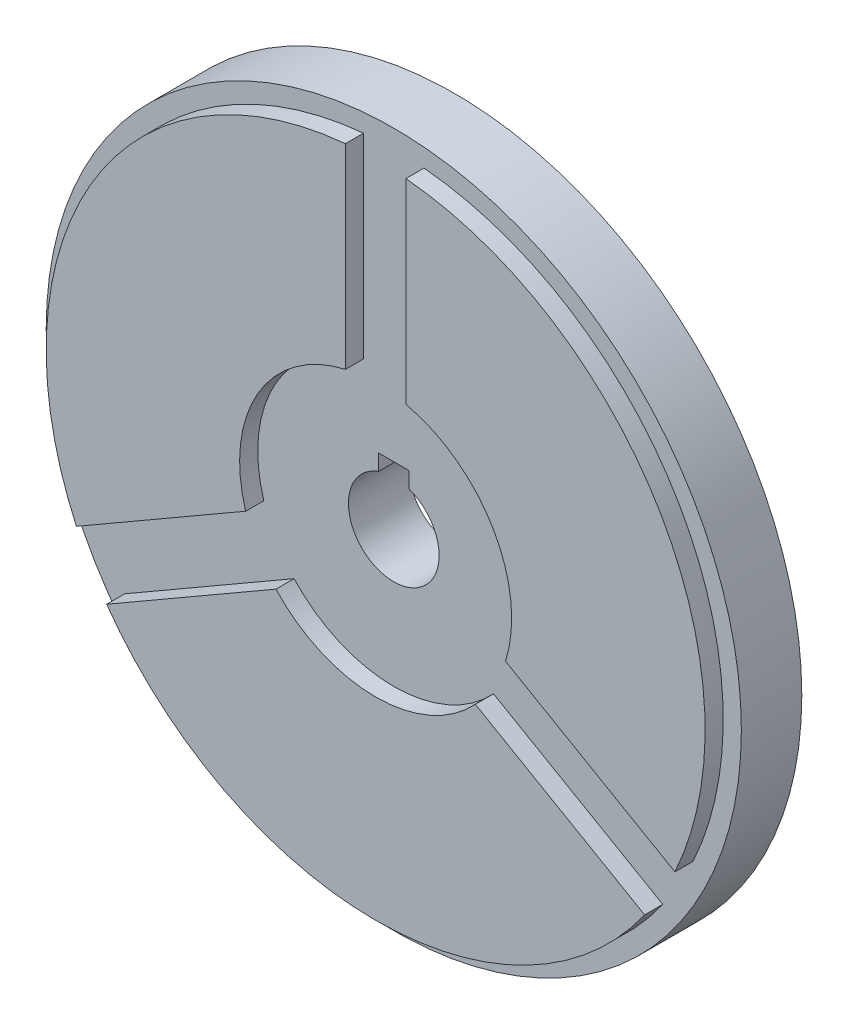
ISO-10303-21;
HEADER;
FILE_DESCRIPTION(('STEP AP214'),'2;1');
FILE_NAME('part.step','',(''),(''),'','','');
FILE_SCHEMA(('AUTOMOTIVE_DESIGN { 1 0 10303 214 1 1 1 1 }'));
ENDSEC;
DATA;
#1=APPLICATION_CONTEXT('core data for automotive mechanical design processes');
#2=APPLICATION_PROTOCOL_DEFINITION('international standard','automotive_design',2000,#1);
#3=PRODUCT_CONTEXT('',#1,'mechanical');
#4=PRODUCT('Part','Part','',(#3));
#5=PRODUCT_RELATED_PRODUCT_CATEGORY('part','',(#4));
#6=PRODUCT_DEFINITION_FORMATION('','',#4);
#7=PRODUCT_DEFINITION_CONTEXT('part definition',#1,'design');
#8=PRODUCT_DEFINITION('design','',#6,#7);
#9=PRODUCT_DEFINITION_SHAPE('','',#8);
#10=(LENGTH_UNIT() NAMED_UNIT(*) SI_UNIT(.MILLI.,.METRE.));
#11=(NAMED_UNIT(*) PLANE_ANGLE_UNIT() SI_UNIT($,.RADIAN.));
#12=(NAMED_UNIT(*) SI_UNIT($,.STERADIAN.) SOLID_ANGLE_UNIT());
#13=UNCERTAINTY_MEASURE_WITH_UNIT(LENGTH_MEASURE(1.E-05),#10,'distance_accuracy_value','');
#14=(GEOMETRIC_REPRESENTATION_CONTEXT(3) GLOBAL_UNCERTAINTY_ASSIGNED_CONTEXT((#13)) GLOBAL_UNIT_ASSIGNED_CONTEXT((#10,
#11,#12)) REPRESENTATION_CONTEXT('',''));
#15=CARTESIAN_POINT('',(0.,0.,0.));
#16=DIRECTION('',(0.,0.,1.));
#17=DIRECTION('',(1.,0.,0.));
#18=AXIS2_PLACEMENT_3D('',#15,#16,#17);
#19=CARTESIAN_POINT('',(0.,0.,-10.));
#20=DIRECTION('',(0.,0.,1.));
#21=DIRECTION('',(1.,0.,0.));
#22=AXIS2_PLACEMENT_3D('',#19,#20,#21);
#23=CYLINDRICAL_SURFACE('',#22,57.5);
#24=CARTESIAN_POINT('',(0.,0.,-10.));
#25=DIRECTION('',(0.,0.,1.));
#26=DIRECTION('',(1.,0.,0.));
#27=AXIS2_PLACEMENT_3D('',#24,#25,#26);
#28=CIRCLE('',#27,57.5);
#29=CARTESIAN_POINT('',(57.5,0.,-10.));
#30=VERTEX_POINT('',#29);
#31=EDGE_CURVE('E322',#30,#30,#28,.T.);
#32=ORIENTED_EDGE('',*,*,#31,.T.);
#33=EDGE_LOOP('',(#32));
#34=FACE_BOUND('',#33,.T.);
#35=CARTESIAN_POINT('',(0.,0.,0.));
#36=DIRECTION('',(0.,0.,1.));
#37=DIRECTION('',(1.,0.,0.));
#38=AXIS2_PLACEMENT_3D('',#35,#36,#37);
#39=CIRCLE('',#38,57.5);
#40=CARTESIAN_POINT('',(57.5,0.,0.));
#41=VERTEX_POINT('',#40);
#42=EDGE_CURVE('E319',#41,#41,#39,.T.);
#43=ORIENTED_EDGE('',*,*,#42,.F.);
#44=EDGE_LOOP('',(#43));
#45=FACE_BOUND('',#44,.T.);
#46=ADVANCED_FACE('F80',(#34,#45),#23,.T.);
#47=CARTESIAN_POINT('',(0.,0.,-10.));
#48=DIRECTION('',(0.,0.,1.));
#49=DIRECTION('',(1.,0.,0.));
#50=AXIS2_PLACEMENT_3D('',#47,#48,#49);
#51=PLANE('',#50);
#52=CARTESIAN_POINT('',(0.,0.,-10.));
#53=DIRECTION('',(0.,0.,1.));
#54=DIRECTION('',(1.,0.,0.));
#55=AXIS2_PLACEMENT_3D('',#52,#53,#54);
#56=CIRCLE('',#55,7.5);
#57=CARTESIAN_POINT('',(-2.5,7.07106781186548,-10.));
#58=VERTEX_POINT('',#57);
#59=CARTESIAN_POINT('',(2.5,7.07106781186548,-10.));
#60=VERTEX_POINT('',#59);
#61=EDGE_CURVE('E215',#58,#60,#56,.T.);
#62=ORIENTED_EDGE('',*,*,#61,.T.);
#63=DIRECTION('',(0.,1.,0.));
#64=VECTOR('',#63,1.);
#65=CARTESIAN_POINT('',(2.5,0.,-10.));
#66=LINE('',#65,#64);
#67=CARTESIAN_POINT('',(2.5,9.7,-10.));
#68=VERTEX_POINT('',#67);
#69=EDGE_CURVE('E195',#60,#68,#66,.T.);
#70=ORIENTED_EDGE('',*,*,#69,.T.);
#71=DIRECTION('',(-1.,0.,0.));
#72=VECTOR('',#71,1.);
#73=CARTESIAN_POINT('',(-2.5,9.7,-10.));
#74=LINE('',#73,#72);
#75=CARTESIAN_POINT('',(-2.5,9.7,-10.));
#76=VERTEX_POINT('',#75);
#77=EDGE_CURVE('E205',#68,#76,#74,.T.);
#78=ORIENTED_EDGE('',*,*,#77,.T.);
#79=DIRECTION('',(0.,-1.,0.));
#80=VECTOR('',#79,1.);
#81=CARTESIAN_POINT('',(-2.5,0.,-10.));
#82=LINE('',#81,#80);
#83=EDGE_CURVE('E202',#76,#58,#82,.T.);
#84=ORIENTED_EDGE('',*,*,#83,.T.);
#85=EDGE_LOOP('',(#62,#70,#78,#84));
#86=FACE_BOUND('',#85,.T.);
#87=ORIENTED_EDGE('',*,*,#31,.F.);
#88=EDGE_LOOP('',(#87));
#89=FACE_BOUND('',#88,.T.);
#90=ADVANCED_FACE('F212',(#86,#89),#51,.F.);
#91=CARTESIAN_POINT('',(0.,0.,0.));
#92=DIRECTION('',(0.,0.,1.));
#93=DIRECTION('',(1.,0.,0.));
#94=AXIS2_PLACEMENT_3D('',#91,#92,#93);
#95=PLANE('',#94);
#96=DIRECTION('',(0.,1.,0.));
#97=VECTOR('',#96,1.);
#98=CARTESIAN_POINT('',(2.5,0.,0.));
#99=LINE('',#98,#97);
#100=CARTESIAN_POINT('',(2.5,7.07106781186548,0.));
#101=VERTEX_POINT('',#100);
#102=CARTESIAN_POINT('',(2.5,9.7,0.));
#103=VERTEX_POINT('',#102);
#104=EDGE_CURVE('E197',#101,#103,#99,.T.);
#105=ORIENTED_EDGE('',*,*,#104,.F.);
#106=CARTESIAN_POINT('',(0.,0.,0.));
#107=DIRECTION('',(0.,0.,1.));
#108=DIRECTION('',(1.,0.,0.));
#109=AXIS2_PLACEMENT_3D('',#106,#107,#108);
#110=CIRCLE('',#109,7.5);
#111=CARTESIAN_POINT('',(-2.5,7.07106781186548,0.));
#112=VERTEX_POINT('',#111);
#113=EDGE_CURVE('E317',#112,#101,#110,.T.);
#114=ORIENTED_EDGE('',*,*,#113,.F.);
#115=DIRECTION('',(0.,-1.,0.));
#116=VECTOR('',#115,1.);
#117=CARTESIAN_POINT('',(-2.5,0.,0.));
#118=LINE('',#117,#116);
#119=CARTESIAN_POINT('',(-2.5,9.7,0.));
#120=VERTEX_POINT('',#119);
#121=EDGE_CURVE('E94',#120,#112,#118,.T.);
#122=ORIENTED_EDGE('',*,*,#121,.F.);
#123=DIRECTION('',(-1.,0.,0.));
#124=VECTOR('',#123,1.);
#125=CARTESIAN_POINT('',(-2.5,9.7,0.));
#126=LINE('',#125,#124);
#127=EDGE_CURVE('E217',#103,#120,#126,.T.);
#128=ORIENTED_EDGE('',*,*,#127,.F.);
#129=EDGE_LOOP('',(#105,#114,#122,#128));
#130=FACE_BOUND('',#129,.T.);
#131=CARTESIAN_POINT('',(0.,0.,0.));
#132=DIRECTION('',(0.,0.,1.));
#133=DIRECTION('',(1.,0.,0.));
#134=AXIS2_PLACEMENT_3D('',#131,#132,#133);
#135=CIRCLE('',#134,22.5);
#136=CARTESIAN_POINT('',(-16.4983551919635,-15.2988325031622,0.));
#137=VERTEX_POINT('',#136);
#138=CARTESIAN_POINT('',(16.4983551919633,-15.2988325031624,0.));
#139=VERTEX_POINT('',#138);
#140=EDGE_CURVE('E223',#137,#139,#135,.T.);
#141=ORIENTED_EDGE('',*,*,#140,.T.);
#142=DIRECTION('',(0.866025403784453,-0.499999999999975,0.));
#143=VECTOR('',#142,1.);
#144=CARTESIAN_POINT('',(52.3373440329332,-35.990482357979,0.));
#145=LINE('',#144,#143);
#146=CARTESIAN_POINT('',(44.4993351016807,-31.46520579161,0.));
#147=VERTEX_POINT('',#146);
#148=EDGE_CURVE('E229',#139,#147,#145,.T.);
#149=ORIENTED_EDGE('',*,*,#148,.T.);
#150=CARTESIAN_POINT('',(0.,0.,0.));
#151=DIRECTION('',(0.,0.,1.));
#152=DIRECTION('',(1.,0.,0.));
#153=AXIS2_PLACEMENT_3D('',#150,#151,#152);
#154=CIRCLE('',#153,54.5);
#155=CARTESIAN_POINT('',(-44.4993351016794,-31.4652057916112,0.));
#156=VERTEX_POINT('',#155);
#157=EDGE_CURVE('E239',#156,#147,#154,.T.);
#158=ORIENTED_EDGE('',*,*,#157,.F.);
#159=DIRECTION('',(-0.866025403784422,-0.500000000000028,0.));
#160=VECTOR('',#159,1.);
#161=CARTESIAN_POINT('',(-52.3373440329377,-35.9904823579842,0.));
#162=LINE('',#161,#160);
#163=EDGE_CURVE('E102',#137,#156,#162,.T.);
#164=ORIENTED_EDGE('',*,*,#163,.F.);
#165=EDGE_LOOP('',(#141,#149,#158,#164));
#166=FACE_BOUND('',#165,.T.);
#167=CARTESIAN_POINT('',(0.,0.,0.));
#168=DIRECTION('',(0.,0.,1.));
#169=DIRECTION('',(1.,0.,0.));
#170=AXIS2_PLACEMENT_3D('',#167,#168,#169);
#171=CIRCLE('',#170,22.5);
#172=CARTESIAN_POINT('',(-5.,21.9374109684803,0.));
#173=VERTEX_POINT('',#172);
#174=CARTESIAN_POINT('',(-21.4983551919634,-6.63857846531777,0.));
#175=VERTEX_POINT('',#174);
#176=EDGE_CURVE('E253',#173,#175,#171,.T.);
#177=ORIENTED_EDGE('',*,*,#176,.T.);
#178=DIRECTION('',(-0.866025403784422,-0.500000000000029,0.));
#179=VECTOR('',#178,1.);
#180=CARTESIAN_POINT('',(-57.337344032938,-27.33022832014,0.));
#181=LINE('',#180,#179);
#182=CARTESIAN_POINT('',(-49.4993351016791,-22.8049517537666,0.));
#183=VERTEX_POINT('',#182);
#184=EDGE_CURVE('E258',#175,#183,#181,.T.);
#185=ORIENTED_EDGE('',*,*,#184,.T.);
#186=CARTESIAN_POINT('',(0.,0.,0.));
#187=DIRECTION('',(0.,0.,1.));
#188=DIRECTION('',(1.,0.,0.));
#189=AXIS2_PLACEMENT_3D('',#186,#187,#188);
#190=CIRCLE('',#189,54.5);
#191=CARTESIAN_POINT('',(-5.,54.2701575453766,0.));
#192=VERTEX_POINT('',#191);
#193=EDGE_CURVE('E270',#192,#183,#190,.T.);
#194=ORIENTED_EDGE('',*,*,#193,.F.);
#195=DIRECTION('',(0.,1.,0.));
#196=VECTOR('',#195,1.);
#197=CARTESIAN_POINT('',(-5.,-126.641421356237,0.));
#198=LINE('',#197,#196);
#199=EDGE_CURVE('E267',#173,#192,#198,.T.);
#200=ORIENTED_EDGE('',*,*,#199,.F.);
#201=EDGE_LOOP('',(#177,#185,#194,#200));
#202=FACE_BOUND('',#201,.T.);
#203=CARTESIAN_POINT('',(0.,0.,0.));
#204=DIRECTION('',(0.,0.,1.));
#205=DIRECTION('',(1.,0.,0.));
#206=AXIS2_PLACEMENT_3D('',#203,#204,#205);
#207=CIRCLE('',#206,22.5);
#208=CARTESIAN_POINT('',(21.4983551919633,-6.63857846531805,0.));
#209=VERTEX_POINT('',#208);
#210=CARTESIAN_POINT('',(5.,21.9374109684803,0.));
#211=VERTEX_POINT('',#210);
#212=EDGE_CURVE('E285',#209,#211,#207,.T.);
#213=ORIENTED_EDGE('',*,*,#212,.T.);
#214=DIRECTION('',(0.,1.,0.));
#215=VECTOR('',#214,1.);
#216=CARTESIAN_POINT('',(5.,-126.641421356237,0.));
#217=LINE('',#216,#215);
#218=CARTESIAN_POINT('',(5.,54.2701575453766,0.));
#219=VERTEX_POINT('',#218);
#220=EDGE_CURVE('E290',#211,#219,#217,.T.);
#221=ORIENTED_EDGE('',*,*,#220,.T.);
#222=CARTESIAN_POINT('',(0.,0.,0.));
#223=DIRECTION('',(0.,0.,1.));
#224=DIRECTION('',(1.,0.,0.));
#225=AXIS2_PLACEMENT_3D('',#222,#223,#224);
#226=CIRCLE('',#225,54.5);
#227=CARTESIAN_POINT('',(49.4993351016802,-22.8049517537654,0.));
#228=VERTEX_POINT('',#227);
#229=EDGE_CURVE('E302',#228,#219,#226,.T.);
#230=ORIENTED_EDGE('',*,*,#229,.F.);
#231=DIRECTION('',(0.866025403784453,-0.499999999999975,0.));
#232=VECTOR('',#231,1.);
#233=CARTESIAN_POINT('',(57.337344032933,-27.3302283201345,0.));
#234=LINE('',#233,#232);
#235=EDGE_CURVE('E299',#209,#228,#234,.T.);
#236=ORIENTED_EDGE('',*,*,#235,.F.);
#237=EDGE_LOOP('',(#213,#221,#230,#236));
#238=FACE_BOUND('',#237,.T.);
#239=ORIENTED_EDGE('',*,*,#42,.T.);
#240=EDGE_LOOP('',(#239));
#241=FACE_BOUND('',#240,.T.);
#242=ADVANCED_FACE('F330',(#130,#166,#202,#238,#241),#95,.T.);
#243=CARTESIAN_POINT('',(0.,0.,-10.));
#244=DIRECTION('',(0.,0.,1.));
#245=DIRECTION('',(1.,0.,0.));
#246=AXIS2_PLACEMENT_3D('',#243,#244,#245);
#247=CYLINDRICAL_SURFACE('',#246,7.5);
#248=ORIENTED_EDGE('',*,*,#113,.T.);
#249=DIRECTION('',(0.,0.,1.));
#250=VECTOR('',#249,1.);
#251=CARTESIAN_POINT('',(2.5,7.07106781186548,-10.));
#252=LINE('',#251,#250);
#253=EDGE_CURVE('E12',#101,#60,#252,.F.);
#254=ORIENTED_EDGE('',*,*,#253,.T.);
#255=ORIENTED_EDGE('',*,*,#61,.F.);
#256=DIRECTION('',(0.,0.,1.));
#257=VECTOR('',#256,1.);
#258=CARTESIAN_POINT('',(-2.5,7.07106781186548,-10.));
#259=LINE('',#258,#257);
#260=EDGE_CURVE('E87',#58,#112,#259,.T.);
#261=ORIENTED_EDGE('',*,*,#260,.T.);
#262=EDGE_LOOP('',(#248,#254,#255,#261));
#263=FACE_BOUND('',#262,.T.);
#264=ADVANCED_FACE('F328',(#263),#247,.F.);
#265=CARTESIAN_POINT('',(0.,0.,3.));
#266=DIRECTION('',(0.,0.,-1.));
#267=DIRECTION('',(-1.,0.,0.));
#268=AXIS2_PLACEMENT_3D('',#265,#266,#267);
#269=CYLINDRICAL_SURFACE('',#268,22.5);
#270=ORIENTED_EDGE('',*,*,#212,.F.);
#271=DIRECTION('',(0.,0.,-1.));
#272=VECTOR('',#271,1.);
#273=CARTESIAN_POINT('',(21.4983551919633,-6.63857846531806,3.));
#274=LINE('',#273,#272);
#275=CARTESIAN_POINT('',(21.4983551919633,-6.63857846531806,3.));
#276=VERTEX_POINT('',#275);
#277=EDGE_CURVE('E314',#276,#209,#274,.T.);
#278=ORIENTED_EDGE('',*,*,#277,.F.);
#279=CARTESIAN_POINT('',(0.,0.,3.));
#280=DIRECTION('',(0.,0.,1.));
#281=DIRECTION('',(1.,0.,0.));
#282=AXIS2_PLACEMENT_3D('',#279,#280,#281);
#283=CIRCLE('',#282,22.5);
#284=CARTESIAN_POINT('',(5.,21.9374109684803,3.));
#285=VERTEX_POINT('',#284);
#286=EDGE_CURVE('E286',#276,#285,#283,.T.);
#287=ORIENTED_EDGE('',*,*,#286,.T.);
#288=DIRECTION('',(0.,0.,-1.));
#289=VECTOR('',#288,1.);
#290=CARTESIAN_POINT('',(5.,21.9374109684803,3.));
#291=LINE('',#290,#289);
#292=EDGE_CURVE('E297',#285,#211,#291,.T.);
#293=ORIENTED_EDGE('',*,*,#292,.T.);
#294=EDGE_LOOP('',(#270,#278,#287,#293));
#295=FACE_BOUND('',#294,.T.);
#296=ADVANCED_FACE('F352',(#295),#269,.F.);
#297=CARTESIAN_POINT('',(57.337344032933,-27.3302283201345,3.));
#298=DIRECTION('',(0.499999999999975,0.866025403784453,0.));
#299=DIRECTION('',(-0.866025403784453,0.499999999999975,0.));
#300=AXIS2_PLACEMENT_3D('',#297,#298,#299);
#301=PLANE('',#300);
#302=ORIENTED_EDGE('',*,*,#235,.T.);
#303=DIRECTION('',(0.,0.,-1.));
#304=VECTOR('',#303,1.);
#305=CARTESIAN_POINT('',(49.4993351016807,-22.8049517537656,3.));
#306=LINE('',#305,#304);
#307=CARTESIAN_POINT('',(49.4993351016807,-22.8049517537656,3.));
#308=VERTEX_POINT('',#307);
#309=EDGE_CURVE('E311',#308,#228,#306,.T.);
#310=ORIENTED_EDGE('',*,*,#309,.F.);
#311=DIRECTION('',(0.866025403784453,-0.499999999999975,0.));
#312=VECTOR('',#311,1.);
#313=CARTESIAN_POINT('',(57.337344032933,-27.3302283201345,3.));
#314=LINE('',#313,#312);
#315=EDGE_CURVE('E289',#276,#308,#314,.T.);
#316=ORIENTED_EDGE('',*,*,#315,.F.);
#317=ORIENTED_EDGE('',*,*,#277,.T.);
#318=EDGE_LOOP('',(#302,#310,#316,#317));
#319=FACE_BOUND('',#318,.T.);
#320=ADVANCED_FACE('F355',(#319),#301,.F.);
#321=CARTESIAN_POINT('',(0.,0.,3.));
#322=DIRECTION('',(0.,0.,-1.));
#323=DIRECTION('',(-1.,0.,0.));
#324=AXIS2_PLACEMENT_3D('',#321,#322,#323);
#325=CYLINDRICAL_SURFACE('',#324,54.5);
#326=ORIENTED_EDGE('',*,*,#229,.T.);
#327=DIRECTION('',(0.,0.,-1.));
#328=VECTOR('',#327,1.);
#329=CARTESIAN_POINT('',(5.,54.2701575453766,3.));
#330=LINE('',#329,#328);
#331=CARTESIAN_POINT('',(5.,54.2701575453766,3.));
#332=VERTEX_POINT('',#331);
#333=EDGE_CURVE('E308',#332,#219,#330,.T.);
#334=ORIENTED_EDGE('',*,*,#333,.F.);
#335=CARTESIAN_POINT('',(0.,0.,3.));
#336=DIRECTION('',(0.,0.,1.));
#337=DIRECTION('',(1.,0.,0.));
#338=AXIS2_PLACEMENT_3D('',#335,#336,#337);
#339=CIRCLE('',#338,54.5);
#340=EDGE_CURVE('E292',#308,#332,#339,.T.);
#341=ORIENTED_EDGE('',*,*,#340,.F.);
#342=ORIENTED_EDGE('',*,*,#309,.T.);
#343=EDGE_LOOP('',(#326,#334,#341,#342));
#344=FACE_BOUND('',#343,.T.);
#345=ADVANCED_FACE('F359',(#344),#325,.T.);
#346=CARTESIAN_POINT('',(5.,-126.641421356237,3.));
#347=DIRECTION('',(-1.,0.,0.));
#348=DIRECTION('',(0.,0.,1.));
#349=AXIS2_PLACEMENT_3D('',#346,#347,#348);
#350=PLANE('',#349);
#351=ORIENTED_EDGE('',*,*,#220,.F.);
#352=ORIENTED_EDGE('',*,*,#292,.F.);
#353=DIRECTION('',(0.,1.,0.));
#354=VECTOR('',#353,1.);
#355=CARTESIAN_POINT('',(5.,-126.641421356237,3.));
#356=LINE('',#355,#354);
#357=EDGE_CURVE('E294',#285,#332,#356,.T.);
#358=ORIENTED_EDGE('',*,*,#357,.T.);
#359=ORIENTED_EDGE('',*,*,#333,.T.);
#360=EDGE_LOOP('',(#351,#352,#358,#359));
#361=FACE_BOUND('',#360,.T.);
#362=ADVANCED_FACE('F363',(#361),#350,.T.);
#363=CARTESIAN_POINT('',(0.,-126.641421356237,3.));
#364=DIRECTION('',(0.,0.,1.));
#365=DIRECTION('',(1.,0.,0.));
#366=AXIS2_PLACEMENT_3D('',#363,#364,#365);
#367=PLANE('',#366);
#368=ORIENTED_EDGE('',*,*,#286,.F.);
#369=ORIENTED_EDGE('',*,*,#315,.T.);
#370=ORIENTED_EDGE('',*,*,#340,.T.);
#371=ORIENTED_EDGE('',*,*,#357,.F.);
#372=EDGE_LOOP('',(#368,#369,#370,#371));
#373=FACE_BOUND('',#372,.T.);
#374=ADVANCED_FACE('F367',(#373),#367,.T.);
#375=CARTESIAN_POINT('',(0.,0.,3.));
#376=DIRECTION('',(0.,0.,-1.));
#377=DIRECTION('',(-1.,0.,0.));
#378=AXIS2_PLACEMENT_3D('',#375,#376,#377);
#379=CYLINDRICAL_SURFACE('',#378,22.5);
#380=ORIENTED_EDGE('',*,*,#176,.F.);
#381=DIRECTION('',(0.,0.,-1.));
#382=VECTOR('',#381,1.);
#383=CARTESIAN_POINT('',(-5.,21.9374109684803,3.));
#384=LINE('',#383,#382);
#385=CARTESIAN_POINT('',(-5.,21.9374109684803,3.));
#386=VERTEX_POINT('',#385);
#387=EDGE_CURVE('E282',#386,#173,#384,.T.);
#388=ORIENTED_EDGE('',*,*,#387,.F.);
#389=CARTESIAN_POINT('',(0.,0.,3.));
#390=DIRECTION('',(0.,0.,1.));
#391=DIRECTION('',(1.,0.,0.));
#392=AXIS2_PLACEMENT_3D('',#389,#390,#391);
#393=CIRCLE('',#392,22.5);
#394=CARTESIAN_POINT('',(-21.4983551919634,-6.63857846531777,3.));
#395=VERTEX_POINT('',#394);
#396=EDGE_CURVE('E254',#386,#395,#393,.T.);
#397=ORIENTED_EDGE('',*,*,#396,.T.);
#398=DIRECTION('',(0.,0.,-1.));
#399=VECTOR('',#398,1.);
#400=CARTESIAN_POINT('',(-21.4983551919634,-6.63857846531777,3.));
#401=LINE('',#400,#399);
#402=EDGE_CURVE('E265',#395,#175,#401,.T.);
#403=ORIENTED_EDGE('',*,*,#402,.T.);
#404=EDGE_LOOP('',(#380,#388,#397,#403));
#405=FACE_BOUND('',#404,.T.);
#406=ADVANCED_FACE('F371',(#405),#379,.F.);
#407=CARTESIAN_POINT('',(-5.,-126.641421356237,3.));
#408=DIRECTION('',(-1.,0.,0.));
#409=DIRECTION('',(0.,0.,1.));
#410=AXIS2_PLACEMENT_3D('',#407,#408,#409);
#411=PLANE('',#410);
#412=ORIENTED_EDGE('',*,*,#199,.T.);
#413=DIRECTION('',(0.,0.,-1.));
#414=VECTOR('',#413,1.);
#415=CARTESIAN_POINT('',(-5.,54.2701575453766,3.));
#416=LINE('',#415,#414);
#417=CARTESIAN_POINT('',(-5.,54.2701575453766,3.));
#418=VERTEX_POINT('',#417);
#419=EDGE_CURVE('E279',#418,#192,#416,.T.);
#420=ORIENTED_EDGE('',*,*,#419,.F.);
#421=DIRECTION('',(0.,1.,0.));
#422=VECTOR('',#421,1.);
#423=CARTESIAN_POINT('',(-5.,-126.641421356237,3.));
#424=LINE('',#423,#422);
#425=EDGE_CURVE('E257',#386,#418,#424,.T.);
#426=ORIENTED_EDGE('',*,*,#425,.F.);
#427=ORIENTED_EDGE('',*,*,#387,.T.);
#428=EDGE_LOOP('',(#412,#420,#426,#427));
#429=FACE_BOUND('',#428,.T.);
#430=ADVANCED_FACE('F375',(#429),#411,.F.);
#431=CARTESIAN_POINT('',(0.,0.,3.));
#432=DIRECTION('',(0.,0.,-1.));
#433=DIRECTION('',(-1.,0.,0.));
#434=AXIS2_PLACEMENT_3D('',#431,#432,#433);
#435=CYLINDRICAL_SURFACE('',#434,54.5);
#436=ORIENTED_EDGE('',*,*,#193,.T.);
#437=DIRECTION('',(0.,0.,-1.));
#438=VECTOR('',#437,1.);
#439=CARTESIAN_POINT('',(-49.4993351016791,-22.8049517537666,3.));
#440=LINE('',#439,#438);
#441=CARTESIAN_POINT('',(-49.4993351016791,-22.8049517537666,3.));
#442=VERTEX_POINT('',#441);
#443=EDGE_CURVE('E276',#442,#183,#440,.T.);
#444=ORIENTED_EDGE('',*,*,#443,.F.);
#445=CARTESIAN_POINT('',(0.,0.,3.));
#446=DIRECTION('',(0.,0.,1.));
#447=DIRECTION('',(1.,0.,0.));
#448=AXIS2_PLACEMENT_3D('',#445,#446,#447);
#449=CIRCLE('',#448,54.5);
#450=EDGE_CURVE('E260',#418,#442,#449,.T.);
#451=ORIENTED_EDGE('',*,*,#450,.F.);
#452=ORIENTED_EDGE('',*,*,#419,.T.);
#453=EDGE_LOOP('',(#436,#444,#451,#452));
#454=FACE_BOUND('',#453,.T.);
#455=ADVANCED_FACE('F379',(#454),#435,.T.);
#456=CARTESIAN_POINT('',(-57.337344032938,-27.33022832014,3.));
#457=DIRECTION('',(0.500000000000028,-0.866025403784422,0.));
#458=DIRECTION('',(0.866025403784422,0.500000000000029,0.));
#459=AXIS2_PLACEMENT_3D('',#456,#457,#458);
#460=PLANE('',#459);
#461=ORIENTED_EDGE('',*,*,#184,.F.);
#462=ORIENTED_EDGE('',*,*,#402,.F.);
#463=DIRECTION('',(-0.866025403784422,-0.500000000000029,0.));
#464=VECTOR('',#463,1.);
#465=CARTESIAN_POINT('',(-57.337344032938,-27.33022832014,3.));
#466=LINE('',#465,#464);
#467=EDGE_CURVE('E262',#395,#442,#466,.T.);
#468=ORIENTED_EDGE('',*,*,#467,.T.);
#469=ORIENTED_EDGE('',*,*,#443,.T.);
#470=EDGE_LOOP('',(#461,#462,#468,#469));
#471=FACE_BOUND('',#470,.T.);
#472=ADVANCED_FACE('F383',(#471),#460,.T.);
#473=CARTESIAN_POINT('',(0.,-126.641421356237,3.));
#474=DIRECTION('',(0.,0.,1.));
#475=DIRECTION('',(1.,0.,0.));
#476=AXIS2_PLACEMENT_3D('',#473,#474,#475);
#477=PLANE('',#476);
#478=ORIENTED_EDGE('',*,*,#396,.F.);
#479=ORIENTED_EDGE('',*,*,#425,.T.);
#480=ORIENTED_EDGE('',*,*,#450,.T.);
#481=ORIENTED_EDGE('',*,*,#467,.F.);
#482=EDGE_LOOP('',(#478,#479,#480,#481));
#483=FACE_BOUND('',#482,.T.);
#484=ADVANCED_FACE('F387',(#483),#477,.T.);
#485=CARTESIAN_POINT('',(0.,0.,3.));
#486=DIRECTION('',(0.,0.,-1.));
#487=DIRECTION('',(-1.,0.,0.));
#488=AXIS2_PLACEMENT_3D('',#485,#486,#487);
#489=CYLINDRICAL_SURFACE('',#488,22.5);
#490=ORIENTED_EDGE('',*,*,#140,.F.);
#491=DIRECTION('',(0.,0.,-1.));
#492=VECTOR('',#491,1.);
#493=CARTESIAN_POINT('',(-16.4983551919635,-15.2988325031622,3.));
#494=LINE('',#493,#492);
#495=CARTESIAN_POINT('',(-16.4983551919635,-15.2988325031622,3.));
#496=VERTEX_POINT('',#495);
#497=EDGE_CURVE('E251',#496,#137,#494,.T.);
#498=ORIENTED_EDGE('',*,*,#497,.F.);
#499=CARTESIAN_POINT('',(0.,0.,3.));
#500=DIRECTION('',(0.,0.,1.));
#501=DIRECTION('',(1.,0.,0.));
#502=AXIS2_PLACEMENT_3D('',#499,#500,#501);
#503=CIRCLE('',#502,22.5);
#504=CARTESIAN_POINT('',(16.4983551919633,-15.2988325031624,3.));
#505=VERTEX_POINT('',#504);
#506=EDGE_CURVE('E225',#496,#505,#503,.T.);
#507=ORIENTED_EDGE('',*,*,#506,.T.);
#508=DIRECTION('',(0.,0.,-1.));
#509=VECTOR('',#508,1.);
#510=CARTESIAN_POINT('',(16.4983551919633,-15.2988325031624,3.));
#511=LINE('',#510,#509);
#512=EDGE_CURVE('E236',#505,#139,#511,.T.);
#513=ORIENTED_EDGE('',*,*,#512,.T.);
#514=EDGE_LOOP('',(#490,#498,#507,#513));
#515=FACE_BOUND('',#514,.T.);
#516=ADVANCED_FACE('F391',(#515),#489,.F.);
#517=CARTESIAN_POINT('',(-52.3373440329377,-35.9904823579842,3.));
#518=DIRECTION('',(0.500000000000028,-0.866025403784422,0.));
#519=DIRECTION('',(0.866025403784422,0.500000000000028,0.));
#520=AXIS2_PLACEMENT_3D('',#517,#518,#519);
#521=PLANE('',#520);
#522=ORIENTED_EDGE('',*,*,#163,.T.);
#523=DIRECTION('',(0.,0.,-1.));
#524=VECTOR('',#523,1.);
#525=CARTESIAN_POINT('',(-44.4993351016791,-31.465205791611,3.));
#526=LINE('',#525,#524);
#527=CARTESIAN_POINT('',(-44.4993351016791,-31.465205791611,3.));
#528=VERTEX_POINT('',#527);
#529=EDGE_CURVE('E248',#528,#156,#526,.T.);
#530=ORIENTED_EDGE('',*,*,#529,.F.);
#531=DIRECTION('',(-0.866025403784422,-0.500000000000028,0.));
#532=VECTOR('',#531,1.);
#533=CARTESIAN_POINT('',(-52.3373440329377,-35.9904823579842,3.));
#534=LINE('',#533,#532);
#535=EDGE_CURVE('E228',#496,#528,#534,.T.);
#536=ORIENTED_EDGE('',*,*,#535,.F.);
#537=ORIENTED_EDGE('',*,*,#497,.T.);
#538=EDGE_LOOP('',(#522,#530,#536,#537));
#539=FACE_BOUND('',#538,.T.);
#540=ADVANCED_FACE('F395',(#539),#521,.F.);
#541=CARTESIAN_POINT('',(0.,0.,3.));
#542=DIRECTION('',(0.,0.,-1.));
#543=DIRECTION('',(-1.,0.,0.));
#544=AXIS2_PLACEMENT_3D('',#541,#542,#543);
#545=CYLINDRICAL_SURFACE('',#544,54.5);
#546=ORIENTED_EDGE('',*,*,#157,.T.);
#547=DIRECTION('',(0.,0.,-1.));
#548=VECTOR('',#547,1.);
#549=CARTESIAN_POINT('',(44.4993351016807,-31.46520579161,3.));
#550=LINE('',#549,#548);
#551=CARTESIAN_POINT('',(44.4993351016807,-31.46520579161,3.));
#552=VERTEX_POINT('',#551);
#553=EDGE_CURVE('E245',#552,#147,#550,.T.);
#554=ORIENTED_EDGE('',*,*,#553,.F.);
#555=CARTESIAN_POINT('',(0.,0.,3.));
#556=DIRECTION('',(0.,0.,1.));
#557=DIRECTION('',(1.,0.,0.));
#558=AXIS2_PLACEMENT_3D('',#555,#556,#557);
#559=CIRCLE('',#558,54.5);
#560=EDGE_CURVE('E231',#528,#552,#559,.T.);
#561=ORIENTED_EDGE('',*,*,#560,.F.);
#562=ORIENTED_EDGE('',*,*,#529,.T.);
#563=EDGE_LOOP('',(#546,#554,#561,#562));
#564=FACE_BOUND('',#563,.T.);
#565=ADVANCED_FACE('F399',(#564),#545,.T.);
#566=CARTESIAN_POINT('',(52.3373440329332,-35.990482357979,3.));
#567=DIRECTION('',(0.499999999999975,0.866025403784453,0.));
#568=DIRECTION('',(-0.866025403784453,0.499999999999975,0.));
#569=AXIS2_PLACEMENT_3D('',#566,#567,#568);
#570=PLANE('',#569);
#571=ORIENTED_EDGE('',*,*,#148,.F.);
#572=ORIENTED_EDGE('',*,*,#512,.F.);
#573=DIRECTION('',(0.866025403784453,-0.499999999999975,0.));
#574=VECTOR('',#573,1.);
#575=CARTESIAN_POINT('',(52.3373440329332,-35.990482357979,3.));
#576=LINE('',#575,#574);
#577=EDGE_CURVE('E233',#505,#552,#576,.T.);
#578=ORIENTED_EDGE('',*,*,#577,.T.);
#579=ORIENTED_EDGE('',*,*,#553,.T.);
#580=EDGE_LOOP('',(#571,#572,#578,#579));
#581=FACE_BOUND('',#580,.T.);
#582=ADVANCED_FACE('F403',(#581),#570,.T.);
#583=CARTESIAN_POINT('',(0.,-126.641421356237,3.));
#584=DIRECTION('',(0.,0.,1.));
#585=DIRECTION('',(1.,0.,0.));
#586=AXIS2_PLACEMENT_3D('',#583,#584,#585);
#587=PLANE('',#586);
#588=ORIENTED_EDGE('',*,*,#506,.F.);
#589=ORIENTED_EDGE('',*,*,#535,.T.);
#590=ORIENTED_EDGE('',*,*,#560,.T.);
#591=ORIENTED_EDGE('',*,*,#577,.F.);
#592=EDGE_LOOP('',(#588,#589,#590,#591));
#593=FACE_BOUND('',#592,.T.);
#594=ADVANCED_FACE('F407',(#593),#587,.T.);
#595=CARTESIAN_POINT('',(2.5,0.,-10.));
#596=DIRECTION('',(1.,0.,0.));
#597=DIRECTION('',(0.,0.,-1.));
#598=AXIS2_PLACEMENT_3D('',#595,#596,#597);
#599=PLANE('',#598);
#600=ORIENTED_EDGE('',*,*,#104,.T.);
#601=DIRECTION('',(0.,0.,1.));
#602=VECTOR('',#601,1.);
#603=CARTESIAN_POINT('',(2.5,9.7,-10.));
#604=LINE('',#603,#602);
#605=EDGE_CURVE('E191',#68,#103,#604,.T.);
#606=ORIENTED_EDGE('',*,*,#605,.F.);
#607=ORIENTED_EDGE('',*,*,#69,.F.);
#608=ORIENTED_EDGE('',*,*,#253,.F.);
#609=EDGE_LOOP('',(#600,#606,#607,#608));
#610=FACE_BOUND('',#609,.T.);
#611=ADVANCED_FACE('F193',(#610),#599,.F.);
#612=CARTESIAN_POINT('',(-2.5,0.,-10.));
#613=DIRECTION('',(-1.,0.,0.));
#614=DIRECTION('',(0.,0.,1.));
#615=AXIS2_PLACEMENT_3D('',#612,#613,#614);
#616=PLANE('',#615);
#617=ORIENTED_EDGE('',*,*,#83,.F.);
#618=DIRECTION('',(0.,0.,1.));
#619=VECTOR('',#618,1.);
#620=CARTESIAN_POINT('',(-2.5,9.7,-10.));
#621=LINE('',#620,#619);
#622=EDGE_CURVE('E201',#76,#120,#621,.T.);
#623=ORIENTED_EDGE('',*,*,#622,.T.);
#624=ORIENTED_EDGE('',*,*,#121,.T.);
#625=ORIENTED_EDGE('',*,*,#260,.F.);
#626=EDGE_LOOP('',(#617,#623,#624,#625));
#627=FACE_BOUND('',#626,.T.);
#628=ADVANCED_FACE('F414',(#627),#616,.F.);
#629=CARTESIAN_POINT('',(-2.5,9.7,-10.));
#630=DIRECTION('',(0.,1.,0.));
#631=DIRECTION('',(0.,0.,1.));
#632=AXIS2_PLACEMENT_3D('',#629,#630,#631);
#633=PLANE('',#632);
#634=ORIENTED_EDGE('',*,*,#127,.T.);
#635=ORIENTED_EDGE('',*,*,#622,.F.);
#636=ORIENTED_EDGE('',*,*,#77,.F.);
#637=ORIENTED_EDGE('',*,*,#605,.T.);
#638=EDGE_LOOP('',(#634,#635,#636,#637));
#639=FACE_BOUND('',#638,.T.);
#640=ADVANCED_FACE('F206',(#639),#633,.F.);
#641=CLOSED_SHELL('',(#46,#90,#242,#264,#296,#320,#345,#362,#374,#406,#430,#455,#472,#484,#516,
#540,#565,#582,#594,#611,#628,#640));
#642=MANIFOLD_SOLID_BREP('B2',#641);
#643=ADVANCED_BREP_SHAPE_REPRESENTATION('',(#18,#642),#14);
#644=SHAPE_DEFINITION_REPRESENTATION(#9,#643);
ENDSEC;
END-ISO-10303-21;
